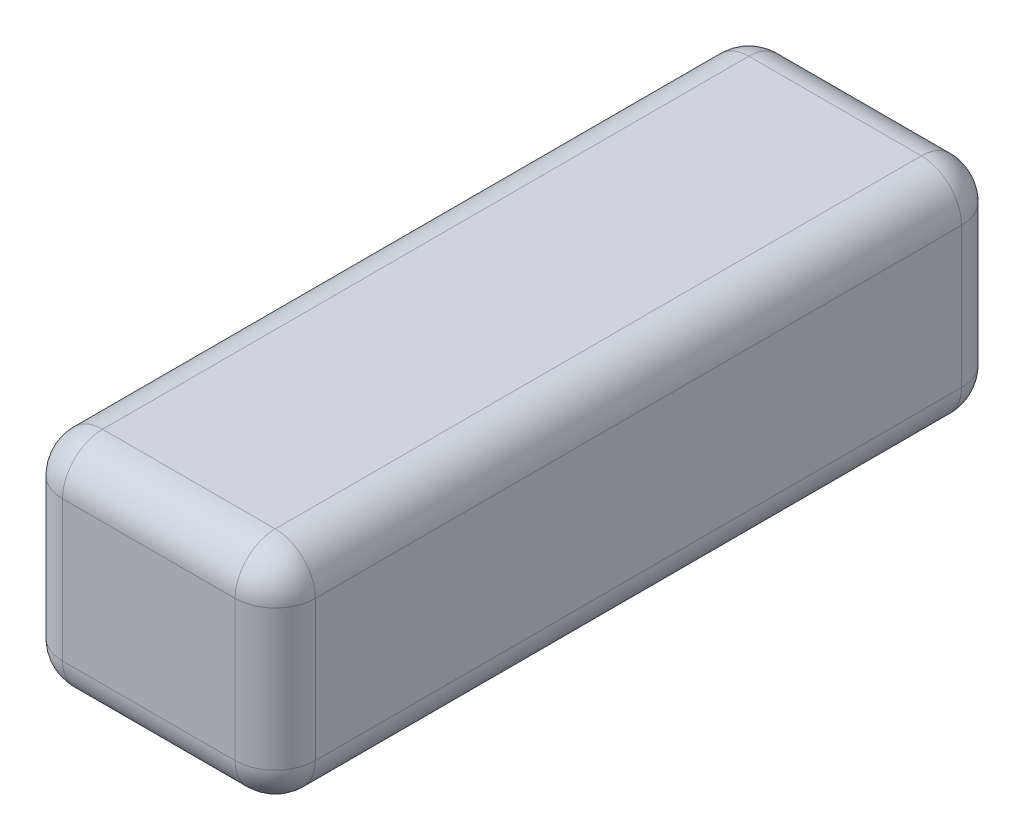
ISO-10303-21;
HEADER;
FILE_DESCRIPTION(('STEP AP214'),'2;1');
FILE_NAME('part.step','',(''),(''),'','','');
FILE_SCHEMA(('AUTOMOTIVE_DESIGN { 1 0 10303 214 1 1 1 1 }'));
ENDSEC;
DATA;
#1=APPLICATION_CONTEXT('core data for automotive mechanical design processes');
#2=APPLICATION_PROTOCOL_DEFINITION('international standard','automotive_design',2000,#1);
#3=PRODUCT_CONTEXT('',#1,'mechanical');
#4=PRODUCT('Part','Part','',(#3));
#5=PRODUCT_RELATED_PRODUCT_CATEGORY('part','',(#4));
#6=PRODUCT_DEFINITION_FORMATION('','',#4);
#7=PRODUCT_DEFINITION_CONTEXT('part definition',#1,'design');
#8=PRODUCT_DEFINITION('design','',#6,#7);
#9=PRODUCT_DEFINITION_SHAPE('','',#8);
#10=(LENGTH_UNIT() NAMED_UNIT(*) SI_UNIT(.MILLI.,.METRE.));
#11=(NAMED_UNIT(*) PLANE_ANGLE_UNIT() SI_UNIT($,.RADIAN.));
#12=(NAMED_UNIT(*) SI_UNIT($,.STERADIAN.) SOLID_ANGLE_UNIT());
#13=UNCERTAINTY_MEASURE_WITH_UNIT(LENGTH_MEASURE(1.E-05),#10,'distance_accuracy_value','');
#14=(GEOMETRIC_REPRESENTATION_CONTEXT(3) GLOBAL_UNCERTAINTY_ASSIGNED_CONTEXT((#13)) GLOBAL_UNIT_ASSIGNED_CONTEXT((#10,
#11,#12)) REPRESENTATION_CONTEXT('',''));
#15=CARTESIAN_POINT('',(0.,0.,0.));
#16=DIRECTION('',(0.,0.,1.));
#17=DIRECTION('',(1.,0.,0.));
#18=AXIS2_PLACEMENT_3D('',#15,#16,#17);
#19=CARTESIAN_POINT('',(0.,13.97,0.));
#20=DIRECTION('',(-1.,0.,0.));
#21=DIRECTION('',(0.,0.,1.));
#22=AXIS2_PLACEMENT_3D('',#19,#20,#21);
#23=PLANE('',#22);
#24=DIRECTION('',(0.,-1.,0.));
#25=VECTOR('',#24,1.);
#26=CARTESIAN_POINT('',(0.,13.97,-2.54));
#27=LINE('',#26,#25);
#28=CARTESIAN_POINT('',(0.,11.43,-2.54));
#29=VERTEX_POINT('',#28);
#30=CARTESIAN_POINT('',(0.,2.54,-2.54));
#31=VERTEX_POINT('',#30);
#32=EDGE_CURVE('E208',#29,#31,#27,.T.);
#33=ORIENTED_EDGE('',*,*,#32,.T.);
#34=DIRECTION('',(0.,0.,-1.));
#35=VECTOR('',#34,1.);
#36=CARTESIAN_POINT('',(0.,2.54,0.));
#37=LINE('',#36,#35);
#38=CARTESIAN_POINT('',(0.,2.54,-43.434));
#39=VERTEX_POINT('',#38);
#40=EDGE_CURVE('E212',#31,#39,#37,.T.);
#41=ORIENTED_EDGE('',*,*,#40,.T.);
#42=DIRECTION('',(0.,-1.,0.));
#43=VECTOR('',#42,1.);
#44=CARTESIAN_POINT('',(0.,13.97,-43.434));
#45=LINE('',#44,#43);
#46=CARTESIAN_POINT('',(0.,11.43,-43.434));
#47=VERTEX_POINT('',#46);
#48=EDGE_CURVE('E205',#39,#47,#45,.F.);
#49=ORIENTED_EDGE('',*,*,#48,.T.);
#50=DIRECTION('',(0.,0.,-1.));
#51=VECTOR('',#50,1.);
#52=CARTESIAN_POINT('',(0.,11.43,0.));
#53=LINE('',#52,#51);
#54=EDGE_CURVE('E202',#47,#29,#53,.F.);
#55=ORIENTED_EDGE('',*,*,#54,.T.);
#56=EDGE_LOOP('',(#33,#41,#49,#55));
#57=FACE_BOUND('',#56,.T.);
#58=ADVANCED_FACE('F45',(#57),#23,.F.);
#59=CARTESIAN_POINT('',(0.,13.97,-45.974));
#60=DIRECTION('',(0.,0.,1.));
#61=DIRECTION('',(1.,0.,0.));
#62=AXIS2_PLACEMENT_3D('',#59,#60,#61);
#63=PLANE('',#62);
#64=DIRECTION('',(-1.,0.,0.));
#65=VECTOR('',#64,1.);
#66=CARTESIAN_POINT('',(0.,11.43,-45.974));
#67=LINE('',#66,#65);
#68=CARTESIAN_POINT('',(-13.462,11.43,-45.974));
#69=VERTEX_POINT('',#68);
#70=CARTESIAN_POINT('',(-2.54,11.43,-45.974));
#71=VERTEX_POINT('',#70);
#72=EDGE_CURVE('E66',#69,#71,#67,.F.);
#73=ORIENTED_EDGE('',*,*,#72,.T.);
#74=DIRECTION('',(0.,-1.,0.));
#75=VECTOR('',#74,1.);
#76=CARTESIAN_POINT('',(-2.54,13.97,-45.974));
#77=LINE('',#76,#75);
#78=CARTESIAN_POINT('',(-2.54,2.54,-45.974));
#79=VERTEX_POINT('',#78);
#80=EDGE_CURVE('E11',#71,#79,#77,.T.);
#81=ORIENTED_EDGE('',*,*,#80,.T.);
#82=DIRECTION('',(-1.,0.,0.));
#83=VECTOR('',#82,1.);
#84=CARTESIAN_POINT('',(0.,2.54,-45.974));
#85=LINE('',#84,#83);
#86=CARTESIAN_POINT('',(-13.462,2.54,-45.974));
#87=VERTEX_POINT('',#86);
#88=EDGE_CURVE('E55',#79,#87,#85,.T.);
#89=ORIENTED_EDGE('',*,*,#88,.T.);
#90=DIRECTION('',(0.,-1.,0.));
#91=VECTOR('',#90,1.);
#92=CARTESIAN_POINT('',(-13.462,13.97,-45.974));
#93=LINE('',#92,#91);
#94=EDGE_CURVE('E228',#87,#69,#93,.F.);
#95=ORIENTED_EDGE('',*,*,#94,.T.);
#96=EDGE_LOOP('',(#73,#81,#89,#95));
#97=FACE_BOUND('',#96,.T.);
#98=ADVANCED_FACE('F354',(#97),#63,.F.);
#99=CARTESIAN_POINT('',(-16.002,13.97,0.));
#100=DIRECTION('',(1.,0.,0.));
#101=DIRECTION('',(0.,0.,-1.));
#102=AXIS2_PLACEMENT_3D('',#99,#100,#101);
#103=PLANE('',#102);
#104=DIRECTION('',(0.,-1.,0.));
#105=VECTOR('',#104,1.);
#106=CARTESIAN_POINT('',(-16.002,13.97,-43.434));
#107=LINE('',#106,#105);
#108=CARTESIAN_POINT('',(-16.002,11.43,-43.434));
#109=VERTEX_POINT('',#108);
#110=CARTESIAN_POINT('',(-16.002,2.54,-43.434));
#111=VERTEX_POINT('',#110);
#112=EDGE_CURVE('E177',#109,#111,#107,.T.);
#113=ORIENTED_EDGE('',*,*,#112,.T.);
#114=DIRECTION('',(0.,0.,1.));
#115=VECTOR('',#114,1.);
#116=CARTESIAN_POINT('',(-16.002,2.54,0.));
#117=LINE('',#116,#115);
#118=CARTESIAN_POINT('',(-16.002,2.54,-2.54));
#119=VERTEX_POINT('',#118);
#120=EDGE_CURVE('E186',#111,#119,#117,.T.);
#121=ORIENTED_EDGE('',*,*,#120,.T.);
#122=DIRECTION('',(0.,-1.,0.));
#123=VECTOR('',#122,1.);
#124=CARTESIAN_POINT('',(-16.002,13.97,-2.54));
#125=LINE('',#124,#123);
#126=CARTESIAN_POINT('',(-16.002,11.43,-2.54));
#127=VERTEX_POINT('',#126);
#128=EDGE_CURVE('E141',#119,#127,#125,.F.);
#129=ORIENTED_EDGE('',*,*,#128,.T.);
#130=DIRECTION('',(0.,0.,1.));
#131=VECTOR('',#130,1.);
#132=CARTESIAN_POINT('',(-16.002,11.43,-45.974));
#133=LINE('',#132,#131);
#134=EDGE_CURVE('E173',#127,#109,#133,.F.);
#135=ORIENTED_EDGE('',*,*,#134,.T.);
#136=EDGE_LOOP('',(#113,#121,#129,#135));
#137=FACE_BOUND('',#136,.T.);
#138=ADVANCED_FACE('F388',(#137),#103,.F.);
#139=CARTESIAN_POINT('',(0.,13.97,0.));
#140=DIRECTION('',(0.,0.,-1.));
#141=DIRECTION('',(-1.,0.,0.));
#142=AXIS2_PLACEMENT_3D('',#139,#140,#141);
#143=PLANE('',#142);
#144=DIRECTION('',(1.,0.,0.));
#145=VECTOR('',#144,1.);
#146=CARTESIAN_POINT('',(-16.002,11.43,0.));
#147=LINE('',#146,#145);
#148=CARTESIAN_POINT('',(-2.54,11.43,0.));
#149=VERTEX_POINT('',#148);
#150=CARTESIAN_POINT('',(-13.462,11.43,0.));
#151=VERTEX_POINT('',#150);
#152=EDGE_CURVE('E170',#149,#151,#147,.F.);
#153=ORIENTED_EDGE('',*,*,#152,.T.);
#154=DIRECTION('',(0.,-1.,0.));
#155=VECTOR('',#154,1.);
#156=CARTESIAN_POINT('',(-13.462,13.97,0.));
#157=LINE('',#156,#155);
#158=CARTESIAN_POINT('',(-13.462,2.54,0.));
#159=VERTEX_POINT('',#158);
#160=EDGE_CURVE('E139',#151,#159,#157,.T.);
#161=ORIENTED_EDGE('',*,*,#160,.T.);
#162=DIRECTION('',(1.,0.,0.));
#163=VECTOR('',#162,1.);
#164=CARTESIAN_POINT('',(0.,2.54,0.));
#165=LINE('',#164,#163);
#166=CARTESIAN_POINT('',(-2.54,2.54,0.));
#167=VERTEX_POINT('',#166);
#168=EDGE_CURVE('E159',#159,#167,#165,.T.);
#169=ORIENTED_EDGE('',*,*,#168,.T.);
#170=DIRECTION('',(0.,-1.,0.));
#171=VECTOR('',#170,1.);
#172=CARTESIAN_POINT('',(-2.54,13.97,0.));
#173=LINE('',#172,#171);
#174=EDGE_CURVE('E166',#167,#149,#173,.F.);
#175=ORIENTED_EDGE('',*,*,#174,.T.);
#176=EDGE_LOOP('',(#153,#161,#169,#175));
#177=FACE_BOUND('',#176,.T.);
#178=ADVANCED_FACE('F168',(#177),#143,.F.);
#179=CARTESIAN_POINT('',(0.,13.97,0.));
#180=DIRECTION('',(0.,1.,0.));
#181=DIRECTION('',(0.,0.,1.));
#182=AXIS2_PLACEMENT_3D('',#179,#180,#181);
#183=PLANE('',#182);
#184=DIRECTION('',(-1.,0.,0.));
#185=VECTOR('',#184,1.);
#186=CARTESIAN_POINT('',(-16.002,13.97,-43.434));
#187=LINE('',#186,#185);
#188=CARTESIAN_POINT('',(-2.54,13.97,-43.434));
#189=VERTEX_POINT('',#188);
#190=CARTESIAN_POINT('',(-13.462,13.97,-43.434));
#191=VERTEX_POINT('',#190);
#192=EDGE_CURVE('E192',#189,#191,#187,.T.);
#193=ORIENTED_EDGE('',*,*,#192,.T.);
#194=DIRECTION('',(0.,0.,1.));
#195=VECTOR('',#194,1.);
#196=CARTESIAN_POINT('',(-13.462,13.97,0.));
#197=LINE('',#196,#195);
#198=CARTESIAN_POINT('',(-13.462,13.97,-2.54));
#199=VERTEX_POINT('',#198);
#200=EDGE_CURVE('E199',#191,#199,#197,.T.);
#201=ORIENTED_EDGE('',*,*,#200,.T.);
#202=DIRECTION('',(1.,0.,0.));
#203=VECTOR('',#202,1.);
#204=CARTESIAN_POINT('',(0.,13.97,-2.54));
#205=LINE('',#204,#203);
#206=CARTESIAN_POINT('',(-2.54,13.97,-2.54));
#207=VERTEX_POINT('',#206);
#208=EDGE_CURVE('E195',#199,#207,#205,.T.);
#209=ORIENTED_EDGE('',*,*,#208,.T.);
#210=DIRECTION('',(0.,0.,-1.));
#211=VECTOR('',#210,1.);
#212=CARTESIAN_POINT('',(-2.54,13.97,-45.974));
#213=LINE('',#212,#211);
#214=EDGE_CURVE('E189',#207,#189,#213,.T.);
#215=ORIENTED_EDGE('',*,*,#214,.T.);
#216=EDGE_LOOP('',(#193,#201,#209,#215));
#217=FACE_BOUND('',#216,.T.);
#218=ADVANCED_FACE('F327',(#217),#183,.T.);
#219=CARTESIAN_POINT('',(0.,0.,0.));
#220=DIRECTION('',(0.,1.,0.));
#221=DIRECTION('',(0.,0.,1.));
#222=AXIS2_PLACEMENT_3D('',#219,#220,#221);
#223=PLANE('',#222);
#224=DIRECTION('',(1.,0.,0.));
#225=VECTOR('',#224,1.);
#226=CARTESIAN_POINT('',(0.,0.,-2.54));
#227=LINE('',#226,#225);
#228=CARTESIAN_POINT('',(-2.54,0.,-2.54));
#229=VERTEX_POINT('',#228);
#230=CARTESIAN_POINT('',(-13.462,0.,-2.54));
#231=VERTEX_POINT('',#230);
#232=EDGE_CURVE('E221',#229,#231,#227,.F.);
#233=ORIENTED_EDGE('',*,*,#232,.T.);
#234=DIRECTION('',(0.,0.,1.));
#235=VECTOR('',#234,1.);
#236=CARTESIAN_POINT('',(-13.462,0.,0.));
#237=LINE('',#236,#235);
#238=CARTESIAN_POINT('',(-13.462,0.,-43.434));
#239=VERTEX_POINT('',#238);
#240=EDGE_CURVE('E225',#231,#239,#237,.F.);
#241=ORIENTED_EDGE('',*,*,#240,.T.);
#242=DIRECTION('',(-1.,0.,0.));
#243=VECTOR('',#242,1.);
#244=CARTESIAN_POINT('',(0.,0.,-43.434));
#245=LINE('',#244,#243);
#246=CARTESIAN_POINT('',(-2.54,0.,-43.434));
#247=VERTEX_POINT('',#246);
#248=EDGE_CURVE('E218',#239,#247,#245,.F.);
#249=ORIENTED_EDGE('',*,*,#248,.T.);
#250=DIRECTION('',(0.,0.,-1.));
#251=VECTOR('',#250,1.);
#252=CARTESIAN_POINT('',(-2.54,0.,0.));
#253=LINE('',#252,#251);
#254=EDGE_CURVE('E215',#247,#229,#253,.F.);
#255=ORIENTED_EDGE('',*,*,#254,.T.);
#256=EDGE_LOOP('',(#233,#241,#249,#255));
#257=FACE_BOUND('',#256,.T.);
#258=ADVANCED_FACE('F420',(#257),#223,.F.);
#259=CARTESIAN_POINT('',(-2.54,13.97,-43.434));
#260=DIRECTION('',(0.,-1.,0.));
#261=DIRECTION('',(0.,0.,-1.));
#262=AXIS2_PLACEMENT_3D('',#259,#260,#261);
#263=CYLINDRICAL_SURFACE('',#262,2.54);
#264=CARTESIAN_POINT('',(-2.54,11.43,-43.434));
#265=DIRECTION('',(0.,1.,0.));
#266=DIRECTION('',(0.,0.,1.));
#267=AXIS2_PLACEMENT_3D('',#264,#265,#266);
#268=CIRCLE('',#267,2.54);
#269=EDGE_CURVE('E49',#47,#71,#268,.T.);
#270=ORIENTED_EDGE('',*,*,#269,.F.);
#271=ORIENTED_EDGE('',*,*,#48,.F.);
#272=CARTESIAN_POINT('',(-2.54,2.54,-43.434));
#273=DIRECTION('',(0.,-1.,0.));
#274=DIRECTION('',(0.,0.,-1.));
#275=AXIS2_PLACEMENT_3D('',#272,#273,#274);
#276=CIRCLE('',#275,2.54);
#277=EDGE_CURVE('E304',#79,#39,#276,.T.);
#278=ORIENTED_EDGE('',*,*,#277,.F.);
#279=ORIENTED_EDGE('',*,*,#80,.F.);
#280=EDGE_LOOP('',(#270,#271,#278,#279));
#281=FACE_BOUND('',#280,.T.);
#282=ADVANCED_FACE('F47',(#281),#263,.T.);
#283=CARTESIAN_POINT('',(-2.54,11.43,-43.434));
#284=DIRECTION('',(0.,0.,-1.));
#285=DIRECTION('',(-1.,0.,0.));
#286=AXIS2_PLACEMENT_3D('',#283,#284,#285);
#287=SPHERICAL_SURFACE('',#286,2.54);
#288=CARTESIAN_POINT('',(-2.54,11.43,-43.434));
#289=DIRECTION('',(0.,0.,-1.));
#290=DIRECTION('',(-1.,0.,0.));
#291=AXIS2_PLACEMENT_3D('',#288,#289,#290);
#292=CIRCLE('',#291,2.54);
#293=EDGE_CURVE('E297',#47,#189,#292,.F.);
#294=ORIENTED_EDGE('',*,*,#293,.F.);
#295=ORIENTED_EDGE('',*,*,#269,.T.);
#296=CARTESIAN_POINT('',(-2.54,11.43,-43.434));
#297=DIRECTION('',(1.,0.,0.));
#298=DIRECTION('',(0.,0.,-1.));
#299=AXIS2_PLACEMENT_3D('',#296,#297,#298);
#300=CIRCLE('',#299,2.54);
#301=EDGE_CURVE('E301',#189,#71,#300,.F.);
#302=ORIENTED_EDGE('',*,*,#301,.F.);
#303=EDGE_LOOP('',(#294,#295,#302));
#304=FACE_BOUND('',#303,.T.);
#305=ADVANCED_FACE('F316',(#304),#287,.T.);
#306=CARTESIAN_POINT('',(-2.54,2.54,-43.434));
#307=DIRECTION('',(1.,0.,0.));
#308=DIRECTION('',(0.,1.,0.));
#309=AXIS2_PLACEMENT_3D('',#306,#307,#308);
#310=SPHERICAL_SURFACE('',#309,2.54);
#311=CARTESIAN_POINT('',(-2.54,2.54,-43.434));
#312=DIRECTION('',(1.,0.,0.));
#313=DIRECTION('',(0.,0.,-1.));
#314=AXIS2_PLACEMENT_3D('',#311,#312,#313);
#315=CIRCLE('',#314,2.54);
#316=EDGE_CURVE('E289',#79,#247,#315,.F.);
#317=ORIENTED_EDGE('',*,*,#316,.F.);
#318=ORIENTED_EDGE('',*,*,#277,.T.);
#319=CARTESIAN_POINT('',(-2.54,2.54,-43.434));
#320=DIRECTION('',(0.,0.,-1.));
#321=DIRECTION('',(-1.,0.,0.));
#322=AXIS2_PLACEMENT_3D('',#319,#320,#321);
#323=CIRCLE('',#322,2.54);
#324=EDGE_CURVE('E293',#247,#39,#323,.F.);
#325=ORIENTED_EDGE('',*,*,#324,.F.);
#326=EDGE_LOOP('',(#317,#318,#325));
#327=FACE_BOUND('',#326,.T.);
#328=ADVANCED_FACE('F348',(#327),#310,.T.);
#329=CARTESIAN_POINT('',(0.,11.43,-43.434));
#330=DIRECTION('',(1.,0.,0.));
#331=DIRECTION('',(0.,0.,-1.));
#332=AXIS2_PLACEMENT_3D('',#329,#330,#331);
#333=CYLINDRICAL_SURFACE('',#332,2.54);
#334=ORIENTED_EDGE('',*,*,#301,.T.);
#335=ORIENTED_EDGE('',*,*,#72,.F.);
#336=CARTESIAN_POINT('',(-13.462,11.43,-43.434));
#337=DIRECTION('',(-1.,0.,0.));
#338=DIRECTION('',(0.,0.,1.));
#339=AXIS2_PLACEMENT_3D('',#336,#337,#338);
#340=CIRCLE('',#339,2.54);
#341=EDGE_CURVE('E281',#191,#69,#340,.T.);
#342=ORIENTED_EDGE('',*,*,#341,.F.);
#343=ORIENTED_EDGE('',*,*,#192,.F.);
#344=EDGE_LOOP('',(#334,#335,#342,#343));
#345=FACE_BOUND('',#344,.T.);
#346=ADVANCED_FACE('F322',(#345),#333,.T.);
#347=CARTESIAN_POINT('',(-2.54,11.43,0.));
#348=DIRECTION('',(0.,0.,1.));
#349=DIRECTION('',(1.,0.,0.));
#350=AXIS2_PLACEMENT_3D('',#347,#348,#349);
#351=CYLINDRICAL_SURFACE('',#350,2.54);
#352=ORIENTED_EDGE('',*,*,#293,.T.);
#353=ORIENTED_EDGE('',*,*,#214,.F.);
#354=CARTESIAN_POINT('',(-2.54,11.43,-2.54));
#355=DIRECTION('',(0.,0.,1.));
#356=DIRECTION('',(1.,0.,0.));
#357=AXIS2_PLACEMENT_3D('',#354,#355,#356);
#358=CIRCLE('',#357,2.54);
#359=EDGE_CURVE('E277',#29,#207,#358,.T.);
#360=ORIENTED_EDGE('',*,*,#359,.F.);
#361=ORIENTED_EDGE('',*,*,#54,.F.);
#362=EDGE_LOOP('',(#352,#353,#360,#361));
#363=FACE_BOUND('',#362,.T.);
#364=ADVANCED_FACE('F333',(#363),#351,.T.);
#365=CARTESIAN_POINT('',(-2.54,13.97,-2.54));
#366=DIRECTION('',(0.,-1.,0.));
#367=DIRECTION('',(0.,0.,-1.));
#368=AXIS2_PLACEMENT_3D('',#365,#366,#367);
#369=CYLINDRICAL_SURFACE('',#368,2.54);
#370=CARTESIAN_POINT('',(-2.54,2.54,-2.54));
#371=DIRECTION('',(0.,-1.,0.));
#372=DIRECTION('',(0.,0.,-1.));
#373=AXIS2_PLACEMENT_3D('',#370,#371,#372);
#374=CIRCLE('',#373,2.54);
#375=EDGE_CURVE('E269',#31,#167,#374,.T.);
#376=ORIENTED_EDGE('',*,*,#375,.F.);
#377=ORIENTED_EDGE('',*,*,#32,.F.);
#378=CARTESIAN_POINT('',(-2.54,11.43,-2.54));
#379=DIRECTION('',(0.,1.,0.));
#380=DIRECTION('',(0.,0.,1.));
#381=AXIS2_PLACEMENT_3D('',#378,#379,#380);
#382=CIRCLE('',#381,2.54);
#383=EDGE_CURVE('E273',#149,#29,#382,.T.);
#384=ORIENTED_EDGE('',*,*,#383,.F.);
#385=ORIENTED_EDGE('',*,*,#174,.F.);
#386=EDGE_LOOP('',(#376,#377,#384,#385));
#387=FACE_BOUND('',#386,.T.);
#388=ADVANCED_FACE('F339',(#387),#369,.T.);
#389=CARTESIAN_POINT('',(-2.54,2.54,0.));
#390=DIRECTION('',(0.,0.,-1.));
#391=DIRECTION('',(-1.,0.,0.));
#392=AXIS2_PLACEMENT_3D('',#389,#390,#391);
#393=CYLINDRICAL_SURFACE('',#392,2.54);
#394=ORIENTED_EDGE('',*,*,#324,.T.);
#395=ORIENTED_EDGE('',*,*,#40,.F.);
#396=CARTESIAN_POINT('',(-2.54,2.54,-2.54));
#397=DIRECTION('',(0.,0.,1.));
#398=DIRECTION('',(1.,0.,0.));
#399=AXIS2_PLACEMENT_3D('',#396,#397,#398);
#400=CIRCLE('',#399,2.54);
#401=EDGE_CURVE('E266',#229,#31,#400,.T.);
#402=ORIENTED_EDGE('',*,*,#401,.F.);
#403=ORIENTED_EDGE('',*,*,#254,.F.);
#404=EDGE_LOOP('',(#394,#395,#402,#403));
#405=FACE_BOUND('',#404,.T.);
#406=ADVANCED_FACE('F345',(#405),#393,.T.);
#407=CARTESIAN_POINT('',(0.,2.54,-43.434));
#408=DIRECTION('',(-1.,0.,0.));
#409=DIRECTION('',(0.,0.,1.));
#410=AXIS2_PLACEMENT_3D('',#407,#408,#409);
#411=CYLINDRICAL_SURFACE('',#410,2.54);
#412=ORIENTED_EDGE('',*,*,#316,.T.);
#413=ORIENTED_EDGE('',*,*,#248,.F.);
#414=CARTESIAN_POINT('',(-13.462,2.54,-43.434));
#415=DIRECTION('',(-1.,0.,0.));
#416=DIRECTION('',(0.,0.,1.));
#417=AXIS2_PLACEMENT_3D('',#414,#415,#416);
#418=CIRCLE('',#417,2.54);
#419=EDGE_CURVE('E262',#87,#239,#418,.T.);
#420=ORIENTED_EDGE('',*,*,#419,.F.);
#421=ORIENTED_EDGE('',*,*,#88,.F.);
#422=EDGE_LOOP('',(#412,#413,#420,#421));
#423=FACE_BOUND('',#422,.T.);
#424=ADVANCED_FACE('F352',(#423),#411,.T.);
#425=CARTESIAN_POINT('',(-13.462,13.97,-43.434));
#426=DIRECTION('',(0.,-1.,0.));
#427=DIRECTION('',(0.,0.,-1.));
#428=AXIS2_PLACEMENT_3D('',#425,#426,#427);
#429=CYLINDRICAL_SURFACE('',#428,2.54);
#430=CARTESIAN_POINT('',(-13.462,11.43,-43.434));
#431=DIRECTION('',(0.,1.,0.));
#432=DIRECTION('',(0.,0.,1.));
#433=AXIS2_PLACEMENT_3D('',#430,#431,#432);
#434=CIRCLE('',#433,2.54);
#435=EDGE_CURVE('E285',#69,#109,#434,.T.);
#436=ORIENTED_EDGE('',*,*,#435,.F.);
#437=ORIENTED_EDGE('',*,*,#94,.F.);
#438=CARTESIAN_POINT('',(-13.462,2.54,-43.434));
#439=DIRECTION('',(0.,-1.,0.));
#440=DIRECTION('',(0.,0.,-1.));
#441=AXIS2_PLACEMENT_3D('',#438,#439,#440);
#442=CIRCLE('',#441,2.54);
#443=EDGE_CURVE('E259',#111,#87,#442,.T.);
#444=ORIENTED_EDGE('',*,*,#443,.F.);
#445=ORIENTED_EDGE('',*,*,#112,.F.);
#446=EDGE_LOOP('',(#436,#437,#444,#445));
#447=FACE_BOUND('',#446,.T.);
#448=ADVANCED_FACE('F357',(#447),#429,.T.);
#449=CARTESIAN_POINT('',(-13.462,11.43,-43.434));
#450=DIRECTION('',(0.,0.,-1.));
#451=DIRECTION('',(-1.,0.,0.));
#452=AXIS2_PLACEMENT_3D('',#449,#450,#451);
#453=SPHERICAL_SURFACE('',#452,2.54);
#454=ORIENTED_EDGE('',*,*,#341,.T.);
#455=ORIENTED_EDGE('',*,*,#435,.T.);
#456=CARTESIAN_POINT('',(-13.462,11.43,-43.434));
#457=DIRECTION('',(0.,0.,-1.));
#458=DIRECTION('',(-1.,0.,0.));
#459=AXIS2_PLACEMENT_3D('',#456,#457,#458);
#460=CIRCLE('',#459,2.54);
#461=EDGE_CURVE('E255',#191,#109,#460,.F.);
#462=ORIENTED_EDGE('',*,*,#461,.F.);
#463=EDGE_LOOP('',(#454,#455,#462));
#464=FACE_BOUND('',#463,.T.);
#465=ADVANCED_FACE('F361',(#464),#453,.T.);
#466=CARTESIAN_POINT('',(-2.54,11.43,-2.54));
#467=DIRECTION('',(1.,0.,0.));
#468=DIRECTION('',(0.,0.,-1.));
#469=AXIS2_PLACEMENT_3D('',#466,#467,#468);
#470=SPHERICAL_SURFACE('',#469,2.54);
#471=ORIENTED_EDGE('',*,*,#383,.T.);
#472=ORIENTED_EDGE('',*,*,#359,.T.);
#473=CARTESIAN_POINT('',(-2.54,11.43,-2.54));
#474=DIRECTION('',(1.,0.,0.));
#475=DIRECTION('',(0.,0.,-1.));
#476=AXIS2_PLACEMENT_3D('',#473,#474,#475);
#477=CIRCLE('',#476,2.54);
#478=EDGE_CURVE('E252',#149,#207,#477,.F.);
#479=ORIENTED_EDGE('',*,*,#478,.F.);
#480=EDGE_LOOP('',(#471,#472,#479));
#481=FACE_BOUND('',#480,.T.);
#482=ADVANCED_FACE('F372',(#481),#470,.T.);
#483=CARTESIAN_POINT('',(-2.54,2.54,-2.54));
#484=DIRECTION('',(1.,0.,0.));
#485=DIRECTION('',(0.,1.,0.));
#486=AXIS2_PLACEMENT_3D('',#483,#484,#485);
#487=SPHERICAL_SURFACE('',#486,2.54);
#488=ORIENTED_EDGE('',*,*,#401,.T.);
#489=ORIENTED_EDGE('',*,*,#375,.T.);
#490=CARTESIAN_POINT('',(-2.54,2.54,-2.54));
#491=DIRECTION('',(1.,0.,0.));
#492=DIRECTION('',(0.,0.,-1.));
#493=AXIS2_PLACEMENT_3D('',#490,#491,#492);
#494=CIRCLE('',#493,2.54);
#495=EDGE_CURVE('E162',#229,#167,#494,.F.);
#496=ORIENTED_EDGE('',*,*,#495,.F.);
#497=EDGE_LOOP('',(#488,#489,#496));
#498=FACE_BOUND('',#497,.T.);
#499=ADVANCED_FACE('F374',(#498),#487,.T.);
#500=CARTESIAN_POINT('',(-13.462,2.54,-43.434));
#501=DIRECTION('',(0.,0.,-1.));
#502=DIRECTION('',(0.,1.,0.));
#503=AXIS2_PLACEMENT_3D('',#500,#501,#502);
#504=SPHERICAL_SURFACE('',#503,2.54);
#505=ORIENTED_EDGE('',*,*,#443,.T.);
#506=ORIENTED_EDGE('',*,*,#419,.T.);
#507=CARTESIAN_POINT('',(-13.462,2.54,-43.434));
#508=DIRECTION('',(0.,0.,-1.));
#509=DIRECTION('',(-1.,0.,0.));
#510=AXIS2_PLACEMENT_3D('',#507,#508,#509);
#511=CIRCLE('',#510,2.54);
#512=EDGE_CURVE('E246',#111,#239,#511,.F.);
#513=ORIENTED_EDGE('',*,*,#512,.F.);
#514=EDGE_LOOP('',(#505,#506,#513));
#515=FACE_BOUND('',#514,.T.);
#516=ADVANCED_FACE('F380',(#515),#504,.T.);
#517=CARTESIAN_POINT('',(-13.462,11.43,0.));
#518=DIRECTION('',(0.,0.,-1.));
#519=DIRECTION('',(-1.,0.,0.));
#520=AXIS2_PLACEMENT_3D('',#517,#518,#519);
#521=CYLINDRICAL_SURFACE('',#520,2.54);
#522=ORIENTED_EDGE('',*,*,#461,.T.);
#523=ORIENTED_EDGE('',*,*,#134,.F.);
#524=CARTESIAN_POINT('',(-13.462,11.43,-2.54));
#525=DIRECTION('',(0.,0.,1.));
#526=DIRECTION('',(1.,0.,0.));
#527=AXIS2_PLACEMENT_3D('',#524,#525,#526);
#528=CIRCLE('',#527,2.54);
#529=EDGE_CURVE('E242',#199,#127,#528,.T.);
#530=ORIENTED_EDGE('',*,*,#529,.F.);
#531=ORIENTED_EDGE('',*,*,#200,.F.);
#532=EDGE_LOOP('',(#522,#523,#530,#531));
#533=FACE_BOUND('',#532,.T.);
#534=ADVANCED_FACE('F365',(#533),#521,.T.);
#535=CARTESIAN_POINT('',(0.,11.43,-2.54));
#536=DIRECTION('',(-1.,0.,0.));
#537=DIRECTION('',(0.,0.,1.));
#538=AXIS2_PLACEMENT_3D('',#535,#536,#537);
#539=CYLINDRICAL_SURFACE('',#538,2.54);
#540=ORIENTED_EDGE('',*,*,#478,.T.);
#541=ORIENTED_EDGE('',*,*,#208,.F.);
#542=CARTESIAN_POINT('',(-13.462,11.43,-2.54));
#543=DIRECTION('',(-1.,0.,0.));
#544=DIRECTION('',(0.,0.,1.));
#545=AXIS2_PLACEMENT_3D('',#542,#543,#544);
#546=CIRCLE('',#545,2.54);
#547=EDGE_CURVE('E156',#151,#199,#546,.T.);
#548=ORIENTED_EDGE('',*,*,#547,.F.);
#549=ORIENTED_EDGE('',*,*,#152,.F.);
#550=EDGE_LOOP('',(#540,#541,#548,#549));
#551=FACE_BOUND('',#550,.T.);
#552=ADVANCED_FACE('F370',(#551),#539,.T.);
#553=CARTESIAN_POINT('',(0.,2.54,-2.54));
#554=DIRECTION('',(1.,0.,0.));
#555=DIRECTION('',(0.,0.,-1.));
#556=AXIS2_PLACEMENT_3D('',#553,#554,#555);
#557=CYLINDRICAL_SURFACE('',#556,2.54);
#558=ORIENTED_EDGE('',*,*,#495,.T.);
#559=ORIENTED_EDGE('',*,*,#168,.F.);
#560=CARTESIAN_POINT('',(-13.462,2.54,-2.54));
#561=DIRECTION('',(-1.,0.,0.));
#562=DIRECTION('',(0.,0.,1.));
#563=AXIS2_PLACEMENT_3D('',#560,#561,#562);
#564=CIRCLE('',#563,2.54);
#565=EDGE_CURVE('E147',#231,#159,#564,.T.);
#566=ORIENTED_EDGE('',*,*,#565,.F.);
#567=ORIENTED_EDGE('',*,*,#232,.F.);
#568=EDGE_LOOP('',(#558,#559,#566,#567));
#569=FACE_BOUND('',#568,.T.);
#570=ADVANCED_FACE('F160',(#569),#557,.T.);
#571=CARTESIAN_POINT('',(-13.462,2.54,0.));
#572=DIRECTION('',(0.,0.,1.));
#573=DIRECTION('',(1.,0.,0.));
#574=AXIS2_PLACEMENT_3D('',#571,#572,#573);
#575=CYLINDRICAL_SURFACE('',#574,2.54);
#576=ORIENTED_EDGE('',*,*,#512,.T.);
#577=ORIENTED_EDGE('',*,*,#240,.F.);
#578=CARTESIAN_POINT('',(-13.462,2.54,-2.54));
#579=DIRECTION('',(0.,0.,1.));
#580=DIRECTION('',(1.,0.,0.));
#581=AXIS2_PLACEMENT_3D('',#578,#579,#580);
#582=CIRCLE('',#581,2.54);
#583=EDGE_CURVE('E151',#119,#231,#582,.T.);
#584=ORIENTED_EDGE('',*,*,#583,.F.);
#585=ORIENTED_EDGE('',*,*,#120,.F.);
#586=EDGE_LOOP('',(#576,#577,#584,#585));
#587=FACE_BOUND('',#586,.T.);
#588=ADVANCED_FACE('F398',(#587),#575,.T.);
#589=CARTESIAN_POINT('',(-13.462,11.43,-2.54));
#590=DIRECTION('',(0.,1.,0.));
#591=DIRECTION('',(0.,0.,1.));
#592=AXIS2_PLACEMENT_3D('',#589,#590,#591);
#593=SPHERICAL_SURFACE('',#592,2.54);
#594=ORIENTED_EDGE('',*,*,#547,.T.);
#595=ORIENTED_EDGE('',*,*,#529,.T.);
#596=CARTESIAN_POINT('',(-13.462,11.43,-2.54));
#597=DIRECTION('',(0.,1.,0.));
#598=DIRECTION('',(0.,0.,1.));
#599=AXIS2_PLACEMENT_3D('',#596,#597,#598);
#600=CIRCLE('',#599,2.54);
#601=EDGE_CURVE('E144',#151,#127,#600,.F.);
#602=ORIENTED_EDGE('',*,*,#601,.F.);
#603=EDGE_LOOP('',(#594,#595,#602));
#604=FACE_BOUND('',#603,.T.);
#605=ADVANCED_FACE('F368',(#604),#593,.T.);
#606=CARTESIAN_POINT('',(-13.462,2.54,-2.54));
#607=DIRECTION('',(0.,-1.,0.));
#608=DIRECTION('',(0.,0.,-1.));
#609=AXIS2_PLACEMENT_3D('',#606,#607,#608);
#610=SPHERICAL_SURFACE('',#609,2.54);
#611=ORIENTED_EDGE('',*,*,#583,.T.);
#612=ORIENTED_EDGE('',*,*,#565,.T.);
#613=CARTESIAN_POINT('',(-13.462,2.54,-2.54));
#614=DIRECTION('',(0.,-1.,0.));
#615=DIRECTION('',(0.,0.,-1.));
#616=AXIS2_PLACEMENT_3D('',#613,#614,#615);
#617=CIRCLE('',#616,2.54);
#618=EDGE_CURVE('E135',#119,#159,#617,.F.);
#619=ORIENTED_EDGE('',*,*,#618,.F.);
#620=EDGE_LOOP('',(#611,#612,#619));
#621=FACE_BOUND('',#620,.T.);
#622=ADVANCED_FACE('F149',(#621),#610,.T.);
#623=CARTESIAN_POINT('',(-13.462,13.97,-2.54));
#624=DIRECTION('',(0.,-1.,0.));
#625=DIRECTION('',(0.,0.,-1.));
#626=AXIS2_PLACEMENT_3D('',#623,#624,#625);
#627=CYLINDRICAL_SURFACE('',#626,2.54);
#628=ORIENTED_EDGE('',*,*,#601,.T.);
#629=ORIENTED_EDGE('',*,*,#128,.F.);
#630=ORIENTED_EDGE('',*,*,#618,.T.);
#631=ORIENTED_EDGE('',*,*,#160,.F.);
#632=EDGE_LOOP('',(#628,#629,#630,#631));
#633=FACE_BOUND('',#632,.T.);
#634=ADVANCED_FACE('F137',(#633),#627,.T.);
#635=CLOSED_SHELL('',(#58,#98,#138,#178,#218,#258,#282,#305,#328,#346,#364,#388,#406,#424,#448,
#465,#482,#499,#516,#534,#552,#570,#588,#605,#622,#634));
#636=MANIFOLD_SOLID_BREP('B2',#635);
#637=ADVANCED_BREP_SHAPE_REPRESENTATION('',(#18,#636),#14);
#638=SHAPE_DEFINITION_REPRESENTATION(#9,#637);
ENDSEC;
END-ISO-10303-21;
